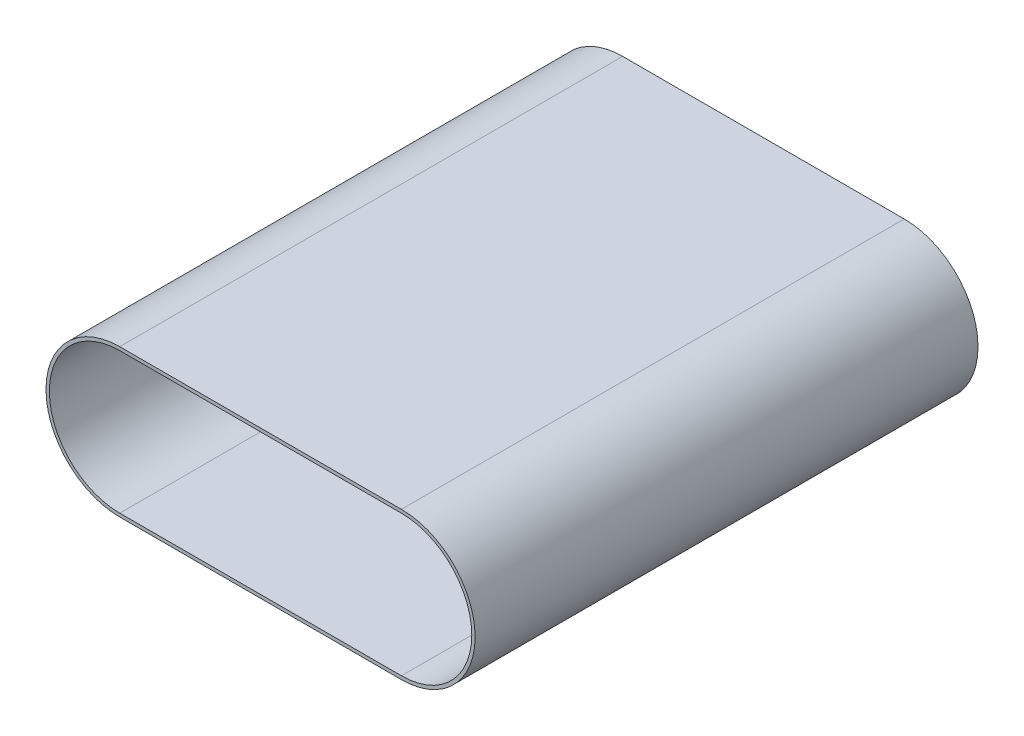
ISO-10303-21;
HEADER;
FILE_DESCRIPTION(('STEP AP214'),'2;1');
FILE_NAME('part.step','',(''),(''),'','','');
FILE_SCHEMA(('AUTOMOTIVE_DESIGN { 1 0 10303 214 1 1 1 1 }'));
ENDSEC;
DATA;
#1=APPLICATION_CONTEXT('core data for automotive mechanical design processes');
#2=APPLICATION_PROTOCOL_DEFINITION('international standard','automotive_design',2000,#1);
#3=PRODUCT_CONTEXT('',#1,'mechanical');
#4=PRODUCT('Part','Part','',(#3));
#5=PRODUCT_RELATED_PRODUCT_CATEGORY('part','',(#4));
#6=PRODUCT_DEFINITION_FORMATION('','',#4);
#7=PRODUCT_DEFINITION_CONTEXT('part definition',#1,'design');
#8=PRODUCT_DEFINITION('design','',#6,#7);
#9=PRODUCT_DEFINITION_SHAPE('','',#8);
#10=(LENGTH_UNIT() NAMED_UNIT(*) SI_UNIT(.MILLI.,.METRE.));
#11=(NAMED_UNIT(*) PLANE_ANGLE_UNIT() SI_UNIT($,.RADIAN.));
#12=(NAMED_UNIT(*) SI_UNIT($,.STERADIAN.) SOLID_ANGLE_UNIT());
#13=UNCERTAINTY_MEASURE_WITH_UNIT(LENGTH_MEASURE(1.E-05),#10,'distance_accuracy_value','');
#14=(GEOMETRIC_REPRESENTATION_CONTEXT(3) GLOBAL_UNCERTAINTY_ASSIGNED_CONTEXT((#13)) GLOBAL_UNIT_ASSIGNED_CONTEXT((#10,
#11,#12)) REPRESENTATION_CONTEXT('',''));
#15=CARTESIAN_POINT('',(0.,0.,0.));
#16=DIRECTION('',(0.,0.,1.));
#17=DIRECTION('',(1.,0.,0.));
#18=AXIS2_PLACEMENT_3D('',#15,#16,#17);
#19=CARTESIAN_POINT('',(-533.4,0.,-1905.));
#20=DIRECTION('',(0.,0.,1.));
#21=DIRECTION('',(1.,0.,0.));
#22=AXIS2_PLACEMENT_3D('',#19,#20,#21);
#23=CYLINDRICAL_SURFACE('',#22,279.4);
#24=CARTESIAN_POINT('',(-533.4,0.,0.));
#25=DIRECTION('',(0.,0.,1.));
#26=DIRECTION('',(1.,0.,0.));
#27=AXIS2_PLACEMENT_3D('',#24,#25,#26);
#28=CIRCLE('',#27,279.4);
#29=CARTESIAN_POINT('',(-533.4,279.4,0.));
#30=VERTEX_POINT('',#29);
#31=CARTESIAN_POINT('',(-533.4,-279.4,0.));
#32=VERTEX_POINT('',#31);
#33=EDGE_CURVE('E180',#30,#32,#28,.T.);
#34=ORIENTED_EDGE('',*,*,#33,.F.);
#35=DIRECTION('',(0.,0.,1.));
#36=VECTOR('',#35,1.);
#37=CARTESIAN_POINT('',(-533.4,279.4,-1905.));
#38=LINE('',#37,#36);
#39=CARTESIAN_POINT('',(-533.4,279.4,-1905.));
#40=VERTEX_POINT('',#39);
#41=EDGE_CURVE('E12',#40,#30,#38,.T.);
#42=ORIENTED_EDGE('',*,*,#41,.F.);
#43=CARTESIAN_POINT('',(-533.4,0.,-1905.));
#44=DIRECTION('',(0.,0.,1.));
#45=DIRECTION('',(1.,0.,0.));
#46=AXIS2_PLACEMENT_3D('',#43,#44,#45);
#47=CIRCLE('',#46,279.4);
#48=CARTESIAN_POINT('',(-533.4,-279.4,-1905.));
#49=VERTEX_POINT('',#48);
#50=EDGE_CURVE('E186',#40,#49,#47,.T.);
#51=ORIENTED_EDGE('',*,*,#50,.T.);
#52=DIRECTION('',(0.,0.,1.));
#53=VECTOR('',#52,1.);
#54=CARTESIAN_POINT('',(-533.4,-279.4,-1905.));
#55=LINE('',#54,#53);
#56=EDGE_CURVE('E74',#49,#32,#55,.T.);
#57=ORIENTED_EDGE('',*,*,#56,.T.);
#58=EDGE_LOOP('',(#34,#42,#51,#57));
#59=FACE_BOUND('',#58,.T.);
#60=ADVANCED_FACE('F71',(#59),#23,.T.);
#61=CARTESIAN_POINT('',(-533.4,279.4,-1905.));
#62=DIRECTION('',(0.,-1.,0.));
#63=DIRECTION('',(0.,0.,-1.));
#64=AXIS2_PLACEMENT_3D('',#61,#62,#63);
#65=PLANE('',#64);
#66=DIRECTION('',(1.,0.,0.));
#67=VECTOR('',#66,1.);
#68=CARTESIAN_POINT('',(-533.4,279.4,0.));
#69=LINE('',#68,#67);
#70=CARTESIAN_POINT('',(533.4,279.4,0.));
#71=VERTEX_POINT('',#70);
#72=EDGE_CURVE('E191',#30,#71,#69,.T.);
#73=ORIENTED_EDGE('',*,*,#72,.T.);
#74=DIRECTION('',(0.,0.,1.));
#75=VECTOR('',#74,1.);
#76=CARTESIAN_POINT('',(533.4,279.4,-1905.));
#77=LINE('',#76,#75);
#78=CARTESIAN_POINT('',(533.4,279.4,-1905.));
#79=VERTEX_POINT('',#78);
#80=EDGE_CURVE('E80',#79,#71,#77,.T.);
#81=ORIENTED_EDGE('',*,*,#80,.F.);
#82=DIRECTION('',(1.,0.,0.));
#83=VECTOR('',#82,1.);
#84=CARTESIAN_POINT('',(-533.4,279.4,-1905.));
#85=LINE('',#84,#83);
#86=EDGE_CURVE('E199',#40,#79,#85,.T.);
#87=ORIENTED_EDGE('',*,*,#86,.F.);
#88=ORIENTED_EDGE('',*,*,#41,.T.);
#89=EDGE_LOOP('',(#73,#81,#87,#88));
#90=FACE_BOUND('',#89,.T.);
#91=ADVANCED_FACE('F233',(#90),#65,.F.);
#92=CARTESIAN_POINT('',(533.4,0.,-1905.));
#93=DIRECTION('',(0.,0.,1.));
#94=DIRECTION('',(1.,0.,0.));
#95=AXIS2_PLACEMENT_3D('',#92,#93,#94);
#96=CYLINDRICAL_SURFACE('',#95,279.4);
#97=CARTESIAN_POINT('',(533.4,0.,0.));
#98=DIRECTION('',(0.,0.,1.));
#99=DIRECTION('',(1.,0.,0.));
#100=AXIS2_PLACEMENT_3D('',#97,#98,#99);
#101=CIRCLE('',#100,279.4);
#102=CARTESIAN_POINT('',(533.4,-279.4,0.));
#103=VERTEX_POINT('',#102);
#104=EDGE_CURVE('E209',#103,#71,#101,.T.);
#105=ORIENTED_EDGE('',*,*,#104,.F.);
#106=DIRECTION('',(0.,0.,1.));
#107=VECTOR('',#106,1.);
#108=CARTESIAN_POINT('',(533.4,-279.4,-1905.));
#109=LINE('',#108,#107);
#110=CARTESIAN_POINT('',(533.4,-279.4,-1905.));
#111=VERTEX_POINT('',#110);
#112=EDGE_CURVE('E217',#111,#103,#109,.T.);
#113=ORIENTED_EDGE('',*,*,#112,.F.);
#114=CARTESIAN_POINT('',(533.4,0.,-1905.));
#115=DIRECTION('',(0.,0.,1.));
#116=DIRECTION('',(1.,0.,0.));
#117=AXIS2_PLACEMENT_3D('',#114,#115,#116);
#118=CIRCLE('',#117,279.4);
#119=EDGE_CURVE('E195',#111,#79,#118,.T.);
#120=ORIENTED_EDGE('',*,*,#119,.T.);
#121=ORIENTED_EDGE('',*,*,#80,.T.);
#122=EDGE_LOOP('',(#105,#113,#120,#121));
#123=FACE_BOUND('',#122,.T.);
#124=ADVANCED_FACE('F237',(#123),#96,.T.);
#125=CARTESIAN_POINT('',(-533.4,-279.4,-1905.));
#126=DIRECTION('',(0.,-1.,0.));
#127=DIRECTION('',(0.,0.,-1.));
#128=AXIS2_PLACEMENT_3D('',#125,#126,#127);
#129=PLANE('',#128);
#130=DIRECTION('',(1.,0.,0.));
#131=VECTOR('',#130,1.);
#132=CARTESIAN_POINT('',(-533.4,-279.4,0.));
#133=LINE('',#132,#131);
#134=EDGE_CURVE('E205',#32,#103,#133,.T.);
#135=ORIENTED_EDGE('',*,*,#134,.F.);
#136=ORIENTED_EDGE('',*,*,#56,.F.);
#137=DIRECTION('',(1.,0.,0.));
#138=VECTOR('',#137,1.);
#139=CARTESIAN_POINT('',(-533.4,-279.4,-1905.));
#140=LINE('',#139,#138);
#141=EDGE_CURVE('E190',#49,#111,#140,.T.);
#142=ORIENTED_EDGE('',*,*,#141,.T.);
#143=ORIENTED_EDGE('',*,*,#112,.T.);
#144=EDGE_LOOP('',(#135,#136,#142,#143));
#145=FACE_BOUND('',#144,.T.);
#146=ADVANCED_FACE('F227',(#145),#129,.T.);
#147=CARTESIAN_POINT('',(-533.4,0.,-1905.));
#148=DIRECTION('',(0.,0.,1.));
#149=DIRECTION('',(1.,0.,0.));
#150=AXIS2_PLACEMENT_3D('',#147,#148,#149);
#151=PLANE('',#150);
#152=DIRECTION('',(1.,0.,0.));
#153=VECTOR('',#152,1.);
#154=CARTESIAN_POINT('',(-533.4,266.7,-1905.));
#155=LINE('',#154,#153);
#156=CARTESIAN_POINT('',(-533.4,266.7,-1905.));
#157=VERTEX_POINT('',#156);
#158=CARTESIAN_POINT('',(533.4,266.7,-1905.));
#159=VERTEX_POINT('',#158);
#160=EDGE_CURVE('E147',#157,#159,#155,.T.);
#161=ORIENTED_EDGE('',*,*,#160,.F.);
#162=CARTESIAN_POINT('',(-533.4,0.,-1905.));
#163=DIRECTION('',(0.,0.,1.));
#164=DIRECTION('',(1.,0.,0.));
#165=AXIS2_PLACEMENT_3D('',#162,#163,#164);
#166=CIRCLE('',#165,266.7);
#167=CARTESIAN_POINT('',(-533.4,-266.7,-1905.));
#168=VERTEX_POINT('',#167);
#169=EDGE_CURVE('E140',#157,#168,#166,.T.);
#170=ORIENTED_EDGE('',*,*,#169,.T.);
#171=DIRECTION('',(1.,0.,0.));
#172=VECTOR('',#171,1.);
#173=CARTESIAN_POINT('',(-533.4,-266.7,-1905.));
#174=LINE('',#173,#172);
#175=CARTESIAN_POINT('',(533.4,-266.7,-1905.));
#176=VERTEX_POINT('',#175);
#177=EDGE_CURVE('E150',#168,#176,#174,.T.);
#178=ORIENTED_EDGE('',*,*,#177,.T.);
#179=CARTESIAN_POINT('',(533.4,0.,-1905.));
#180=DIRECTION('',(0.,0.,1.));
#181=DIRECTION('',(1.,0.,0.));
#182=AXIS2_PLACEMENT_3D('',#179,#180,#181);
#183=CIRCLE('',#182,266.7);
#184=EDGE_CURVE('E88',#176,#159,#183,.T.);
#185=ORIENTED_EDGE('',*,*,#184,.T.);
#186=EDGE_LOOP('',(#161,#170,#178,#185));
#187=FACE_BOUND('',#186,.T.);
#188=ORIENTED_EDGE('',*,*,#50,.F.);
#189=ORIENTED_EDGE('',*,*,#86,.T.);
#190=ORIENTED_EDGE('',*,*,#119,.F.);
#191=ORIENTED_EDGE('',*,*,#141,.F.);
#192=EDGE_LOOP('',(#188,#189,#190,#191));
#193=FACE_BOUND('',#192,.T.);
#194=ADVANCED_FACE('F155',(#187,#193),#151,.F.);
#195=CARTESIAN_POINT('',(-533.4,0.,0.));
#196=DIRECTION('',(0.,0.,1.));
#197=DIRECTION('',(1.,0.,0.));
#198=AXIS2_PLACEMENT_3D('',#195,#196,#197);
#199=PLANE('',#198);
#200=CARTESIAN_POINT('',(-533.4,0.,0.));
#201=DIRECTION('',(0.,0.,1.));
#202=DIRECTION('',(1.,0.,0.));
#203=AXIS2_PLACEMENT_3D('',#200,#201,#202);
#204=CIRCLE('',#203,266.7);
#205=CARTESIAN_POINT('',(-533.4,266.7,0.));
#206=VERTEX_POINT('',#205);
#207=CARTESIAN_POINT('',(-533.4,-266.7,0.));
#208=VERTEX_POINT('',#207);
#209=EDGE_CURVE('E96',#206,#208,#204,.T.);
#210=ORIENTED_EDGE('',*,*,#209,.F.);
#211=DIRECTION('',(1.,0.,0.));
#212=VECTOR('',#211,1.);
#213=CARTESIAN_POINT('',(-533.4,266.7,0.));
#214=LINE('',#213,#212);
#215=CARTESIAN_POINT('',(533.4,266.7,0.));
#216=VERTEX_POINT('',#215);
#217=EDGE_CURVE('E158',#206,#216,#214,.T.);
#218=ORIENTED_EDGE('',*,*,#217,.T.);
#219=CARTESIAN_POINT('',(533.4,0.,0.));
#220=DIRECTION('',(0.,0.,1.));
#221=DIRECTION('',(1.,0.,0.));
#222=AXIS2_PLACEMENT_3D('',#219,#220,#221);
#223=CIRCLE('',#222,266.7);
#224=CARTESIAN_POINT('',(533.4,-266.7,0.));
#225=VERTEX_POINT('',#224);
#226=EDGE_CURVE('E162',#225,#216,#223,.T.);
#227=ORIENTED_EDGE('',*,*,#226,.F.);
#228=DIRECTION('',(1.,0.,0.));
#229=VECTOR('',#228,1.);
#230=CARTESIAN_POINT('',(-533.4,-266.7,0.));
#231=LINE('',#230,#229);
#232=EDGE_CURVE('E171',#208,#225,#231,.T.);
#233=ORIENTED_EDGE('',*,*,#232,.F.);
#234=EDGE_LOOP('',(#210,#218,#227,#233));
#235=FACE_BOUND('',#234,.T.);
#236=ORIENTED_EDGE('',*,*,#33,.T.);
#237=ORIENTED_EDGE('',*,*,#134,.T.);
#238=ORIENTED_EDGE('',*,*,#104,.T.);
#239=ORIENTED_EDGE('',*,*,#72,.F.);
#240=EDGE_LOOP('',(#236,#237,#238,#239));
#241=FACE_BOUND('',#240,.T.);
#242=ADVANCED_FACE('F230',(#235,#241),#199,.T.);
#243=CARTESIAN_POINT('',(-533.4,0.,-1905.));
#244=DIRECTION('',(0.,0.,1.));
#245=DIRECTION('',(1.,0.,0.));
#246=AXIS2_PLACEMENT_3D('',#243,#244,#245);
#247=CYLINDRICAL_SURFACE('',#246,266.7);
#248=ORIENTED_EDGE('',*,*,#209,.T.);
#249=DIRECTION('',(0.,0.,1.));
#250=VECTOR('',#249,1.);
#251=CARTESIAN_POINT('',(-533.4,-266.7,-1905.));
#252=LINE('',#251,#250);
#253=EDGE_CURVE('E136',#168,#208,#252,.T.);
#254=ORIENTED_EDGE('',*,*,#253,.F.);
#255=ORIENTED_EDGE('',*,*,#169,.F.);
#256=DIRECTION('',(0.,0.,1.));
#257=VECTOR('',#256,1.);
#258=CARTESIAN_POINT('',(-533.4,266.7,-1905.));
#259=LINE('',#258,#257);
#260=EDGE_CURVE('E177',#157,#206,#259,.T.);
#261=ORIENTED_EDGE('',*,*,#260,.T.);
#262=EDGE_LOOP('',(#248,#254,#255,#261));
#263=FACE_BOUND('',#262,.T.);
#264=ADVANCED_FACE('F138',(#263),#247,.F.);
#265=CARTESIAN_POINT('',(-533.4,266.7,-1905.));
#266=DIRECTION('',(0.,-1.,0.));
#267=DIRECTION('',(0.,0.,-1.));
#268=AXIS2_PLACEMENT_3D('',#265,#266,#267);
#269=PLANE('',#268);
#270=ORIENTED_EDGE('',*,*,#217,.F.);
#271=ORIENTED_EDGE('',*,*,#260,.F.);
#272=ORIENTED_EDGE('',*,*,#160,.T.);
#273=DIRECTION('',(0.,0.,1.));
#274=VECTOR('',#273,1.);
#275=CARTESIAN_POINT('',(533.4,266.7,-1905.));
#276=LINE('',#275,#274);
#277=EDGE_CURVE('E181',#159,#216,#276,.T.);
#278=ORIENTED_EDGE('',*,*,#277,.T.);
#279=EDGE_LOOP('',(#270,#271,#272,#278));
#280=FACE_BOUND('',#279,.T.);
#281=ADVANCED_FACE('F290',(#280),#269,.T.);
#282=CARTESIAN_POINT('',(533.4,0.,-1905.));
#283=DIRECTION('',(0.,0.,1.));
#284=DIRECTION('',(1.,0.,0.));
#285=AXIS2_PLACEMENT_3D('',#282,#283,#284);
#286=CYLINDRICAL_SURFACE('',#285,266.7);
#287=ORIENTED_EDGE('',*,*,#226,.T.);
#288=ORIENTED_EDGE('',*,*,#277,.F.);
#289=ORIENTED_EDGE('',*,*,#184,.F.);
#290=DIRECTION('',(0.,0.,1.));
#291=VECTOR('',#290,1.);
#292=CARTESIAN_POINT('',(533.4,-266.7,-1905.));
#293=LINE('',#292,#291);
#294=EDGE_CURVE('E146',#176,#225,#293,.T.);
#295=ORIENTED_EDGE('',*,*,#294,.T.);
#296=EDGE_LOOP('',(#287,#288,#289,#295));
#297=FACE_BOUND('',#296,.T.);
#298=ADVANCED_FACE('F299',(#297),#286,.F.);
#299=CARTESIAN_POINT('',(-533.4,-266.7,-1905.));
#300=DIRECTION('',(0.,-1.,0.));
#301=DIRECTION('',(1.,0.,0.));
#302=AXIS2_PLACEMENT_3D('',#299,#300,#301);
#303=PLANE('',#302);
#304=ORIENTED_EDGE('',*,*,#232,.T.);
#305=ORIENTED_EDGE('',*,*,#294,.F.);
#306=ORIENTED_EDGE('',*,*,#177,.F.);
#307=ORIENTED_EDGE('',*,*,#253,.T.);
#308=EDGE_LOOP('',(#304,#305,#306,#307));
#309=FACE_BOUND('',#308,.T.);
#310=ADVANCED_FACE('F151',(#309),#303,.F.);
#311=CLOSED_SHELL('',(#60,#91,#124,#146,#194,#242,#264,#281,#298,#310));
#312=MANIFOLD_SOLID_BREP('B2',#311);
#313=ADVANCED_BREP_SHAPE_REPRESENTATION('',(#18,#312),#14);
#314=SHAPE_DEFINITION_REPRESENTATION(#9,#313);
ENDSEC;
END-ISO-10303-21;
